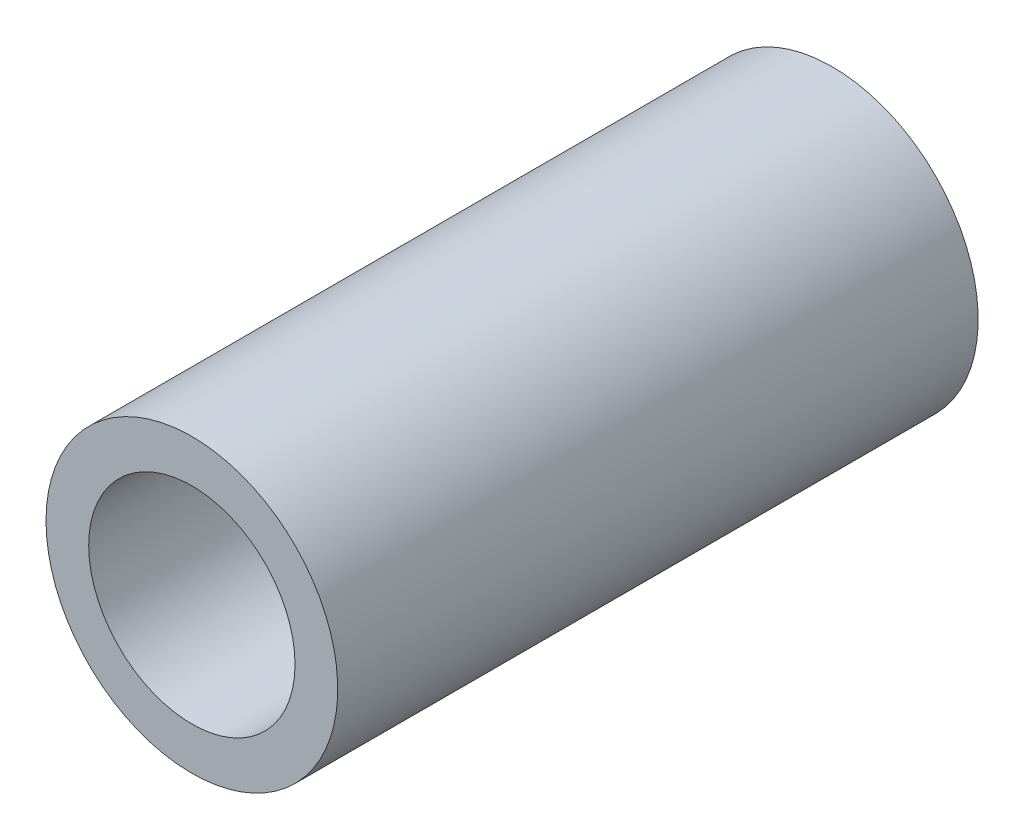
ISO-10303-21;
HEADER;
FILE_DESCRIPTION(('STEP AP214'),'2;1');
FILE_NAME('part.step','',(''),(''),'','','');
FILE_SCHEMA(('AUTOMOTIVE_DESIGN { 1 0 10303 214 1 1 1 1 }'));
ENDSEC;
DATA;
#1=APPLICATION_CONTEXT('core data for automotive mechanical design processes');
#2=APPLICATION_PROTOCOL_DEFINITION('international standard','automotive_design',2000,#1);
#3=PRODUCT_CONTEXT('',#1,'mechanical');
#4=PRODUCT('Part','Part','',(#3));
#5=PRODUCT_RELATED_PRODUCT_CATEGORY('part','',(#4));
#6=PRODUCT_DEFINITION_FORMATION('','',#4);
#7=PRODUCT_DEFINITION_CONTEXT('part definition',#1,'design');
#8=PRODUCT_DEFINITION('design','',#6,#7);
#9=PRODUCT_DEFINITION_SHAPE('','',#8);
#10=(LENGTH_UNIT() NAMED_UNIT(*) SI_UNIT(.MILLI.,.METRE.));
#11=(NAMED_UNIT(*) PLANE_ANGLE_UNIT() SI_UNIT($,.RADIAN.));
#12=(NAMED_UNIT(*) SI_UNIT($,.STERADIAN.) SOLID_ANGLE_UNIT());
#13=UNCERTAINTY_MEASURE_WITH_UNIT(LENGTH_MEASURE(1.E-05),#10,'distance_accuracy_value','');
#14=(GEOMETRIC_REPRESENTATION_CONTEXT(3) GLOBAL_UNCERTAINTY_ASSIGNED_CONTEXT((#13)) GLOBAL_UNIT_ASSIGNED_CONTEXT((#10,
#11,#12)) REPRESENTATION_CONTEXT('',''));
#15=CARTESIAN_POINT('',(0.,0.,0.));
#16=DIRECTION('',(0.,0.,1.));
#17=DIRECTION('',(1.,0.,0.));
#18=AXIS2_PLACEMENT_3D('',#15,#16,#17);
#19=CARTESIAN_POINT('',(0.,0.,22.5));
#20=DIRECTION('',(0.,0.,1.));
#21=DIRECTION('',(1.,0.,0.));
#22=AXIS2_PLACEMENT_3D('',#19,#20,#21);
#23=PLANE('',#22);
#24=CARTESIAN_POINT('',(0.,0.,22.5));
#25=DIRECTION('',(0.,0.,1.));
#26=DIRECTION('',(1.,0.,0.));
#27=AXIS2_PLACEMENT_3D('',#24,#25,#26);
#28=CIRCLE('',#27,10.25);
#29=CARTESIAN_POINT('',(-10.25,0.,22.5));
#30=VERTEX_POINT('',#29);
#31=EDGE_CURVE('E10',#30,#30,#28,.T.);
#32=ORIENTED_EDGE('',*,*,#31,.T.);
#33=EDGE_LOOP('',(#32));
#34=FACE_BOUND('',#33,.T.);
#35=CARTESIAN_POINT('',(0.,0.,22.5));
#36=DIRECTION('',(0.,0.,1.));
#37=DIRECTION('',(1.,0.,0.));
#38=AXIS2_PLACEMENT_3D('',#35,#36,#37);
#39=CIRCLE('',#38,7.25);
#40=CARTESIAN_POINT('',(-7.25,0.,22.5));
#41=VERTEX_POINT('',#40);
#42=EDGE_CURVE('E41',#41,#41,#39,.T.);
#43=ORIENTED_EDGE('',*,*,#42,.F.);
#44=EDGE_LOOP('',(#43));
#45=FACE_BOUND('',#44,.T.);
#46=ADVANCED_FACE('F30',(#34,#45),#23,.T.);
#47=CARTESIAN_POINT('',(0.,0.,-22.5));
#48=DIRECTION('',(0.,0.,1.));
#49=DIRECTION('',(1.,0.,0.));
#50=AXIS2_PLACEMENT_3D('',#47,#48,#49);
#51=PLANE('',#50);
#52=CARTESIAN_POINT('',(0.,0.,-22.5));
#53=DIRECTION('',(0.,0.,1.));
#54=DIRECTION('',(1.,0.,0.));
#55=AXIS2_PLACEMENT_3D('',#52,#53,#54);
#56=CIRCLE('',#55,10.25);
#57=CARTESIAN_POINT('',(-10.25,0.,-22.5));
#58=VERTEX_POINT('',#57);
#59=EDGE_CURVE('E34',#58,#58,#56,.T.);
#60=ORIENTED_EDGE('',*,*,#59,.F.);
#61=EDGE_LOOP('',(#60));
#62=FACE_BOUND('',#61,.T.);
#63=CARTESIAN_POINT('',(0.,0.,-22.5));
#64=DIRECTION('',(0.,0.,1.));
#65=DIRECTION('',(1.,0.,0.));
#66=AXIS2_PLACEMENT_3D('',#63,#64,#65);
#67=CIRCLE('',#66,7.25);
#68=CARTESIAN_POINT('',(-7.25,0.,-22.5));
#69=VERTEX_POINT('',#68);
#70=EDGE_CURVE('E43',#69,#69,#67,.T.);
#71=ORIENTED_EDGE('',*,*,#70,.T.);
#72=EDGE_LOOP('',(#71));
#73=FACE_BOUND('',#72,.T.);
#74=ADVANCED_FACE('F53',(#62,#73),#51,.F.);
#75=CARTESIAN_POINT('',(0.,0.,22.5));
#76=DIRECTION('',(0.,0.,-1.));
#77=DIRECTION('',(-1.,0.,0.));
#78=AXIS2_PLACEMENT_3D('',#75,#76,#77);
#79=CYLINDRICAL_SURFACE('',#78,10.25);
#80=CARTESIAN_POINT('',(-10.25,0.,22.5));
#81=CARTESIAN_POINT('',(-10.25,0.,22.03125));
#82=CARTESIAN_POINT('',(-10.25,0.,21.5625));
#83=CARTESIAN_POINT('',(-10.25,0.,20.625));
#84=CARTESIAN_POINT('',(-10.25,0.,20.15625));
#85=CARTESIAN_POINT('',(-10.25,0.,19.21875));
#86=CARTESIAN_POINT('',(-10.25,0.,18.75));
#87=CARTESIAN_POINT('',(-10.25,0.,17.8125));
#88=CARTESIAN_POINT('',(-10.25,0.,17.34375));
#89=CARTESIAN_POINT('',(-10.25,0.,16.40625));
#90=CARTESIAN_POINT('',(-10.25,0.,15.9375));
#91=CARTESIAN_POINT('',(-10.25,0.,15.));
#92=CARTESIAN_POINT('',(-10.25,0.,14.53125));
#93=CARTESIAN_POINT('',(-10.25,0.,13.59375));
#94=CARTESIAN_POINT('',(-10.25,0.,13.125));
#95=CARTESIAN_POINT('',(-10.25,0.,12.1875));
#96=CARTESIAN_POINT('',(-10.25,0.,11.71875));
#97=CARTESIAN_POINT('',(-10.25,0.,10.78125));
#98=CARTESIAN_POINT('',(-10.25,0.,10.3125));
#99=CARTESIAN_POINT('',(-10.25,0.,9.37499999999999));
#100=CARTESIAN_POINT('',(-10.25,0.,8.90625));
#101=CARTESIAN_POINT('',(-10.25,0.,7.96874999999999));
#102=CARTESIAN_POINT('',(-10.25,0.,7.5));
#103=CARTESIAN_POINT('',(-10.25,0.,6.5625));
#104=CARTESIAN_POINT('',(-10.25,0.,6.09375));
#105=CARTESIAN_POINT('',(-10.25,0.,5.15625));
#106=CARTESIAN_POINT('',(-10.25,0.,4.6875));
#107=CARTESIAN_POINT('',(-10.25,0.,3.75));
#108=CARTESIAN_POINT('',(-10.25,0.,3.28125));
#109=CARTESIAN_POINT('',(-10.25,0.,2.34375));
#110=CARTESIAN_POINT('',(-10.25,0.,1.875));
#111=CARTESIAN_POINT('',(-10.25,0.,0.937499999999997));
#112=CARTESIAN_POINT('',(-10.25,0.,0.468749999999997));
#113=CARTESIAN_POINT('',(-10.25,0.,-0.468750000000004));
#114=CARTESIAN_POINT('',(-10.25,0.,-0.937500000000004));
#115=CARTESIAN_POINT('',(-10.25,0.,-1.87500000000001));
#116=CARTESIAN_POINT('',(-10.25,0.,-2.34375000000001));
#117=CARTESIAN_POINT('',(-10.25,0.,-3.28125));
#118=CARTESIAN_POINT('',(-10.25,0.,-3.75));
#119=CARTESIAN_POINT('',(-10.25,0.,-4.6875));
#120=CARTESIAN_POINT('',(-10.25,0.,-5.15625));
#121=CARTESIAN_POINT('',(-10.25,0.,-6.09375000000001));
#122=CARTESIAN_POINT('',(-10.25,0.,-6.56250000000001));
#123=CARTESIAN_POINT('',(-10.25,0.,-7.50000000000001));
#124=CARTESIAN_POINT('',(-10.25,0.,-7.96875000000001));
#125=CARTESIAN_POINT('',(-10.25,0.,-8.90625));
#126=CARTESIAN_POINT('',(-10.25,0.,-9.37500000000001));
#127=CARTESIAN_POINT('',(-10.25,0.,-10.3125));
#128=CARTESIAN_POINT('',(-10.25,0.,-10.78125));
#129=CARTESIAN_POINT('',(-10.25,0.,-11.71875));
#130=CARTESIAN_POINT('',(-10.25,0.,-12.1875));
#131=CARTESIAN_POINT('',(-10.25,0.,-13.125));
#132=CARTESIAN_POINT('',(-10.25,0.,-13.59375));
#133=CARTESIAN_POINT('',(-10.25,0.,-14.53125));
#134=CARTESIAN_POINT('',(-10.25,0.,-15.));
#135=CARTESIAN_POINT('',(-10.25,0.,-15.9375));
#136=CARTESIAN_POINT('',(-10.25,0.,-16.40625));
#137=CARTESIAN_POINT('',(-10.25,0.,-17.34375));
#138=CARTESIAN_POINT('',(-10.25,0.,-17.8125));
#139=CARTESIAN_POINT('',(-10.25,0.,-18.75));
#140=CARTESIAN_POINT('',(-10.25,0.,-19.21875));
#141=CARTESIAN_POINT('',(-10.25,0.,-20.15625));
#142=CARTESIAN_POINT('',(-10.25,0.,-20.625));
#143=CARTESIAN_POINT('',(-10.25,0.,-21.5625));
#144=CARTESIAN_POINT('',(-10.25,0.,-22.03125));
#145=CARTESIAN_POINT('',(-10.25,0.,-22.5));
#146=B_SPLINE_CURVE_WITH_KNOTS('',3,(#80,#81,#82,#83,#84,#85,#86,#87,#88,#89,#90,#91,#92,#93,
#94,#95,#96,#97,#98,#99,#100,#101,#102,#103,#104,#105,#106,#107,#108,#109,#110,#111,#112,#113,
#114,#115,#116,#117,#118,#119,#120,#121,#122,#123,#124,#125,#126,#127,#128,#129,#130,#131,#132,
#133,#134,#135,#136,#137,#138,#139,#140,#141,#142,#143,#144,#145),.UNSPECIFIED.,.F.,.F.,(4,2,2,
2,2,2,2,2,2,2,2,2,2,2,2,2,2,2,2,2,2,2,2,2,2,2,2,2,2,2,2,2,4),(0.,1.40625,2.8125,4.21875,5.625,
7.03125,8.4375,9.84375,11.25,12.65625,14.0625,15.46875,16.875,18.28125,19.6875,21.09375,22.5,
23.90625,25.3125,26.71875,28.125,29.53125,30.9375,32.34375,33.75,35.15625,36.5625,37.96875,
39.375,40.78125,42.1875,43.59375,45.),.UNSPECIFIED.);
#147=EDGE_CURVE('BSEAM32',#30,#58,#146,.T.);
#148=ORIENTED_EDGE('',*,*,#31,.F.);
#149=ORIENTED_EDGE('',*,*,#59,.T.);
#150=ORIENTED_EDGE('',*,*,#147,.T.);
#151=ORIENTED_EDGE('',*,*,#147,.F.);
#152=EDGE_LOOP('',(#148,#150,#149,#151));
#153=FACE_BOUND('',#152,.T.);
#154=ADVANCED_FACE('F32',(#153),#79,.T.);
#155=CARTESIAN_POINT('',(0.,0.,22.5));
#156=DIRECTION('',(0.,0.,-1.));
#157=DIRECTION('',(-1.,0.,0.));
#158=AXIS2_PLACEMENT_3D('',#155,#156,#157);
#159=CYLINDRICAL_SURFACE('',#158,7.25);
#160=CARTESIAN_POINT('',(-7.25,0.,22.5));
#161=CARTESIAN_POINT('',(-7.25,0.,22.03125));
#162=CARTESIAN_POINT('',(-7.25,0.,21.5625));
#163=CARTESIAN_POINT('',(-7.25,0.,20.625));
#164=CARTESIAN_POINT('',(-7.25,0.,20.15625));
#165=CARTESIAN_POINT('',(-7.25,0.,19.21875));
#166=CARTESIAN_POINT('',(-7.25,0.,18.75));
#167=CARTESIAN_POINT('',(-7.25,0.,17.8125));
#168=CARTESIAN_POINT('',(-7.25,0.,17.34375));
#169=CARTESIAN_POINT('',(-7.25,0.,16.40625));
#170=CARTESIAN_POINT('',(-7.25,0.,15.9375));
#171=CARTESIAN_POINT('',(-7.25,0.,15.));
#172=CARTESIAN_POINT('',(-7.25,0.,14.53125));
#173=CARTESIAN_POINT('',(-7.25,0.,13.59375));
#174=CARTESIAN_POINT('',(-7.25,0.,13.125));
#175=CARTESIAN_POINT('',(-7.25,0.,12.1875));
#176=CARTESIAN_POINT('',(-7.25,0.,11.71875));
#177=CARTESIAN_POINT('',(-7.25,0.,10.78125));
#178=CARTESIAN_POINT('',(-7.25,0.,10.3125));
#179=CARTESIAN_POINT('',(-7.25,0.,9.37499999999999));
#180=CARTESIAN_POINT('',(-7.25,0.,8.90625));
#181=CARTESIAN_POINT('',(-7.25,0.,7.96874999999999));
#182=CARTESIAN_POINT('',(-7.25,0.,7.5));
#183=CARTESIAN_POINT('',(-7.25,0.,6.5625));
#184=CARTESIAN_POINT('',(-7.25,0.,6.09375));
#185=CARTESIAN_POINT('',(-7.25,0.,5.15625));
#186=CARTESIAN_POINT('',(-7.25,0.,4.6875));
#187=CARTESIAN_POINT('',(-7.25,0.,3.75));
#188=CARTESIAN_POINT('',(-7.25,0.,3.28125));
#189=CARTESIAN_POINT('',(-7.25,0.,2.34375));
#190=CARTESIAN_POINT('',(-7.25,0.,1.875));
#191=CARTESIAN_POINT('',(-7.25,0.,0.937499999999997));
#192=CARTESIAN_POINT('',(-7.25,0.,0.468749999999997));
#193=CARTESIAN_POINT('',(-7.25,0.,-0.468750000000004));
#194=CARTESIAN_POINT('',(-7.25,0.,-0.937500000000004));
#195=CARTESIAN_POINT('',(-7.25,0.,-1.87500000000001));
#196=CARTESIAN_POINT('',(-7.25,0.,-2.34375000000001));
#197=CARTESIAN_POINT('',(-7.25,0.,-3.28125));
#198=CARTESIAN_POINT('',(-7.25,0.,-3.75));
#199=CARTESIAN_POINT('',(-7.25,0.,-4.6875));
#200=CARTESIAN_POINT('',(-7.25,0.,-5.15625));
#201=CARTESIAN_POINT('',(-7.25,0.,-6.09375000000001));
#202=CARTESIAN_POINT('',(-7.25,0.,-6.56250000000001));
#203=CARTESIAN_POINT('',(-7.25,0.,-7.50000000000001));
#204=CARTESIAN_POINT('',(-7.25,0.,-7.96875000000001));
#205=CARTESIAN_POINT('',(-7.25,0.,-8.90625));
#206=CARTESIAN_POINT('',(-7.25,0.,-9.37500000000001));
#207=CARTESIAN_POINT('',(-7.25,0.,-10.3125));
#208=CARTESIAN_POINT('',(-7.25,0.,-10.78125));
#209=CARTESIAN_POINT('',(-7.25,0.,-11.71875));
#210=CARTESIAN_POINT('',(-7.25,0.,-12.1875));
#211=CARTESIAN_POINT('',(-7.25,0.,-13.125));
#212=CARTESIAN_POINT('',(-7.25,0.,-13.59375));
#213=CARTESIAN_POINT('',(-7.25,0.,-14.53125));
#214=CARTESIAN_POINT('',(-7.25,0.,-15.));
#215=CARTESIAN_POINT('',(-7.25,0.,-15.9375));
#216=CARTESIAN_POINT('',(-7.25,0.,-16.40625));
#217=CARTESIAN_POINT('',(-7.25,0.,-17.34375));
#218=CARTESIAN_POINT('',(-7.25,0.,-17.8125));
#219=CARTESIAN_POINT('',(-7.25,0.,-18.75));
#220=CARTESIAN_POINT('',(-7.25,0.,-19.21875));
#221=CARTESIAN_POINT('',(-7.25,0.,-20.15625));
#222=CARTESIAN_POINT('',(-7.25,0.,-20.625));
#223=CARTESIAN_POINT('',(-7.25,0.,-21.5625));
#224=CARTESIAN_POINT('',(-7.25,0.,-22.03125));
#225=CARTESIAN_POINT('',(-7.25,0.,-22.5));
#226=B_SPLINE_CURVE_WITH_KNOTS('',3,(#160,#161,#162,#163,#164,#165,#166,#167,#168,#169,#170,
#171,#172,#173,#174,#175,#176,#177,#178,#179,#180,#181,#182,#183,#184,#185,#186,#187,#188,#189,
#190,#191,#192,#193,#194,#195,#196,#197,#198,#199,#200,#201,#202,#203,#204,#205,#206,#207,#208,
#209,#210,#211,#212,#213,#214,#215,#216,#217,#218,#219,#220,#221,#222,#223,#224,#225),
.UNSPECIFIED.,.F.,.F.,(4,2,2,2,2,2,2,2,2,2,2,2,2,2,2,2,2,2,2,2,2,2,2,2,2,2,2,2,2,2,2,2,4),(0.,
1.40625,2.8125,4.21875,5.625,7.03125,8.4375,9.84375,11.25,12.65625,14.0625,15.46875,16.875,
18.28125,19.6875,21.09375,22.5,23.90625,25.3125,26.71875,28.125,29.53125,30.9375,32.34375,33.75,
35.15625,36.5625,37.96875,39.375,40.78125,42.1875,43.59375,45.),.UNSPECIFIED.);
#227=EDGE_CURVE('BSEAM49',#41,#69,#226,.T.);
#228=ORIENTED_EDGE('',*,*,#42,.T.);
#229=ORIENTED_EDGE('',*,*,#70,.F.);
#230=ORIENTED_EDGE('',*,*,#227,.T.);
#231=ORIENTED_EDGE('',*,*,#227,.F.);
#232=EDGE_LOOP('',(#228,#230,#229,#231));
#233=FACE_BOUND('',#232,.T.);
#234=ADVANCED_FACE('F49',(#233),#159,.F.);
#235=CLOSED_SHELL('',(#46,#74,#154,#234));
#236=MANIFOLD_SOLID_BREP('B2',#235);
#237=ADVANCED_BREP_SHAPE_REPRESENTATION('',(#18,#236),#14);
#238=SHAPE_DEFINITION_REPRESENTATION(#9,#237);
ENDSEC;
END-ISO-10303-21;
